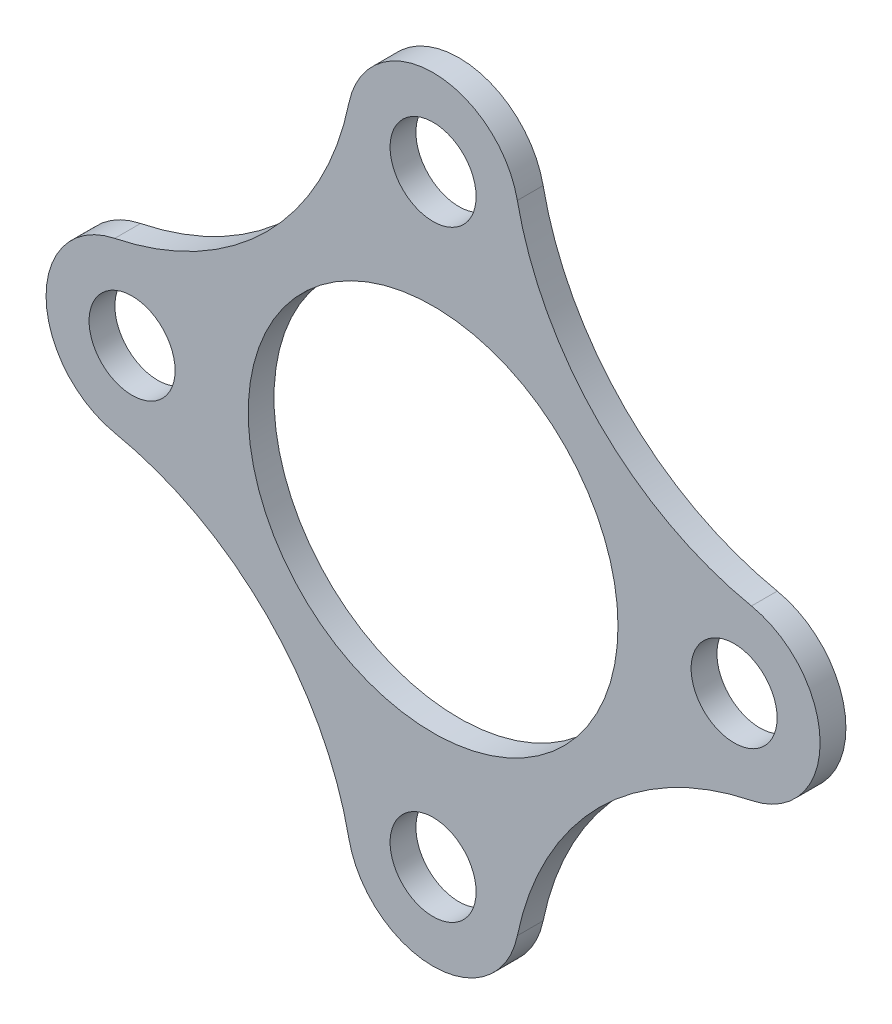
ISO-10303-21;
HEADER;
FILE_DESCRIPTION(('STEP AP214'),'2;1');
FILE_NAME('part.step','',(''),(''),'','','');
FILE_SCHEMA(('AUTOMOTIVE_DESIGN { 1 0 10303 214 1 1 1 1 }'));
ENDSEC;
DATA;
#1=APPLICATION_CONTEXT('core data for automotive mechanical design processes');
#2=APPLICATION_PROTOCOL_DEFINITION('international standard','automotive_design',2000,#1);
#3=PRODUCT_CONTEXT('',#1,'mechanical');
#4=PRODUCT('Part','Part','',(#3));
#5=PRODUCT_RELATED_PRODUCT_CATEGORY('part','',(#4));
#6=PRODUCT_DEFINITION_FORMATION('','',#4);
#7=PRODUCT_DEFINITION_CONTEXT('part definition',#1,'design');
#8=PRODUCT_DEFINITION('design','',#6,#7);
#9=PRODUCT_DEFINITION_SHAPE('','',#8);
#10=(LENGTH_UNIT() NAMED_UNIT(*) SI_UNIT(.MILLI.,.METRE.));
#11=(NAMED_UNIT(*) PLANE_ANGLE_UNIT() SI_UNIT($,.RADIAN.));
#12=(NAMED_UNIT(*) SI_UNIT($,.STERADIAN.) SOLID_ANGLE_UNIT());
#13=UNCERTAINTY_MEASURE_WITH_UNIT(LENGTH_MEASURE(1.E-05),#10,'distance_accuracy_value','');
#14=(GEOMETRIC_REPRESENTATION_CONTEXT(3) GLOBAL_UNCERTAINTY_ASSIGNED_CONTEXT((#13)) GLOBAL_UNIT_ASSIGNED_CONTEXT((#10,
#11,#12)) REPRESENTATION_CONTEXT('',''));
#15=CARTESIAN_POINT('',(0.,0.,0.));
#16=DIRECTION('',(0.,0.,1.));
#17=DIRECTION('',(1.,0.,0.));
#18=AXIS2_PLACEMENT_3D('',#15,#16,#17);
#19=CARTESIAN_POINT('',(0.,-35.,3.));
#20=DIRECTION('',(0.,0.,-1.));
#21=DIRECTION('',(-1.,0.,0.));
#22=AXIS2_PLACEMENT_3D('',#19,#20,#21);
#23=CYLINDRICAL_SURFACE('',#22,10.);
#24=DIRECTION('',(0.,0.,-1.));
#25=VECTOR('',#24,1.);
#26=CARTESIAN_POINT('',(9.79452545151926,-37.0167476737415,47.5909934210712));
#27=LINE('',#26,#25);
#28=CARTESIAN_POINT('',(9.79452545151926,-37.0167476737415,3.));
#29=VERTEX_POINT('',#28);
#30=CARTESIAN_POINT('',(9.79452545151926,-37.0167476737415,0.));
#31=VERTEX_POINT('',#30);
#32=EDGE_CURVE('E102',#29,#31,#27,.T.);
#33=ORIENTED_EDGE('',*,*,#32,.F.);
#34=CARTESIAN_POINT('',(0.,-35.,3.));
#35=DIRECTION('',(0.,0.,1.));
#36=DIRECTION('',(1.,0.,0.));
#37=AXIS2_PLACEMENT_3D('',#34,#35,#36);
#38=CIRCLE('',#37,10.);
#39=CARTESIAN_POINT('',(-9.79452545151924,-37.0167476737415,3.));
#40=VERTEX_POINT('',#39);
#41=EDGE_CURVE('E153',#40,#29,#38,.T.);
#42=ORIENTED_EDGE('',*,*,#41,.F.);
#43=DIRECTION('',(0.,0.,-1.));
#44=VECTOR('',#43,1.);
#45=CARTESIAN_POINT('',(-9.79452545151923,-37.0167476737415,47.5909934210712));
#46=LINE('',#45,#44);
#47=CARTESIAN_POINT('',(-9.79452545151923,-37.0167476737415,0.));
#48=VERTEX_POINT('',#47);
#49=EDGE_CURVE('E126',#40,#48,#46,.T.);
#50=ORIENTED_EDGE('',*,*,#49,.T.);
#51=CARTESIAN_POINT('',(0.,-35.,0.));
#52=DIRECTION('',(0.,0.,1.));
#53=DIRECTION('',(1.,0.,0.));
#54=AXIS2_PLACEMENT_3D('',#51,#52,#53);
#55=CIRCLE('',#54,10.);
#56=EDGE_CURVE('E120',#48,#31,#55,.T.);
#57=ORIENTED_EDGE('',*,*,#56,.T.);
#58=EDGE_LOOP('',(#33,#42,#50,#57));
#59=FACE_BOUND('',#58,.T.);
#60=ADVANCED_FACE('F36',(#59),#23,.T.);
#61=CARTESIAN_POINT('',(35.,0.,3.));
#62=DIRECTION('',(0.,0.,-1.));
#63=DIRECTION('',(-1.,0.,0.));
#64=AXIS2_PLACEMENT_3D('',#61,#62,#63);
#65=CYLINDRICAL_SURFACE('',#64,10.);
#66=DIRECTION('',(0.,0.,-1.));
#67=VECTOR('',#66,1.);
#68=CARTESIAN_POINT('',(37.0167476737415,-9.79452545151924,47.5909934210712));
#69=LINE('',#68,#67);
#70=CARTESIAN_POINT('',(37.0167476737415,-9.79452545151924,3.));
#71=VERTEX_POINT('',#70);
#72=CARTESIAN_POINT('',(37.0167476737415,-9.79452545151924,0.));
#73=VERTEX_POINT('',#72);
#74=EDGE_CURVE('E123',#71,#73,#69,.T.);
#75=ORIENTED_EDGE('',*,*,#74,.T.);
#76=CARTESIAN_POINT('',(35.,0.,0.));
#77=DIRECTION('',(0.,0.,1.));
#78=DIRECTION('',(1.,0.,0.));
#79=AXIS2_PLACEMENT_3D('',#76,#77,#78);
#80=CIRCLE('',#79,10.);
#81=CARTESIAN_POINT('',(37.0167476737415,9.79452545151924,0.));
#82=VERTEX_POINT('',#81);
#83=EDGE_CURVE('E122',#73,#82,#80,.T.);
#84=ORIENTED_EDGE('',*,*,#83,.T.);
#85=DIRECTION('',(0.,0.,-1.));
#86=VECTOR('',#85,1.);
#87=CARTESIAN_POINT('',(37.0167476737415,9.79452545151924,47.5909934210712));
#88=LINE('',#87,#86);
#89=CARTESIAN_POINT('',(37.0167476737415,9.79452545151924,3.));
#90=VERTEX_POINT('',#89);
#91=EDGE_CURVE('E330',#90,#82,#88,.T.);
#92=ORIENTED_EDGE('',*,*,#91,.F.);
#93=CARTESIAN_POINT('',(35.,0.,3.));
#94=DIRECTION('',(0.,0.,1.));
#95=DIRECTION('',(1.,0.,0.));
#96=AXIS2_PLACEMENT_3D('',#93,#94,#95);
#97=CIRCLE('',#96,10.);
#98=EDGE_CURVE('E156',#71,#90,#97,.T.);
#99=ORIENTED_EDGE('',*,*,#98,.F.);
#100=EDGE_LOOP('',(#75,#84,#92,#99));
#101=FACE_BOUND('',#100,.T.);
#102=ADVANCED_FACE('F200',(#101),#65,.T.);
#103=CARTESIAN_POINT('',(-35.,0.,3.));
#104=DIRECTION('',(0.,0.,-1.));
#105=DIRECTION('',(-1.,0.,0.));
#106=AXIS2_PLACEMENT_3D('',#103,#104,#105);
#107=CYLINDRICAL_SURFACE('',#106,10.);
#108=DIRECTION('',(0.,0.,-1.));
#109=VECTOR('',#108,1.);
#110=CARTESIAN_POINT('',(-37.0167476737415,-9.79452545151926,47.5909934210712));
#111=LINE('',#110,#109);
#112=CARTESIAN_POINT('',(-37.0167476737415,-9.79452545151926,3.));
#113=VERTEX_POINT('',#112);
#114=CARTESIAN_POINT('',(-37.0167476737415,-9.79452545151926,0.));
#115=VERTEX_POINT('',#114);
#116=EDGE_CURVE('E322',#113,#115,#111,.T.);
#117=ORIENTED_EDGE('',*,*,#116,.F.);
#118=CARTESIAN_POINT('',(-35.,0.,3.));
#119=DIRECTION('',(0.,0.,1.));
#120=DIRECTION('',(1.,0.,0.));
#121=AXIS2_PLACEMENT_3D('',#118,#119,#120);
#122=CIRCLE('',#121,10.);
#123=CARTESIAN_POINT('',(-37.0167476737415,9.79452545151924,3.));
#124=VERTEX_POINT('',#123);
#125=EDGE_CURVE('E150',#124,#113,#122,.T.);
#126=ORIENTED_EDGE('',*,*,#125,.F.);
#127=DIRECTION('',(0.,0.,-1.));
#128=VECTOR('',#127,1.);
#129=CARTESIAN_POINT('',(-37.0167476737415,9.79452545151925,47.5909934210712));
#130=LINE('',#129,#128);
#131=CARTESIAN_POINT('',(-37.0167476737415,9.79452545151925,0.));
#132=VERTEX_POINT('',#131);
#133=EDGE_CURVE('E339',#124,#132,#130,.T.);
#134=ORIENTED_EDGE('',*,*,#133,.T.);
#135=CARTESIAN_POINT('',(-35.,0.,0.));
#136=DIRECTION('',(0.,0.,1.));
#137=DIRECTION('',(1.,0.,0.));
#138=AXIS2_PLACEMENT_3D('',#135,#136,#137);
#139=CIRCLE('',#138,10.);
#140=EDGE_CURVE('E127',#132,#115,#139,.T.);
#141=ORIENTED_EDGE('',*,*,#140,.T.);
#142=EDGE_LOOP('',(#117,#126,#134,#141));
#143=FACE_BOUND('',#142,.T.);
#144=ADVANCED_FACE('F38',(#143),#107,.T.);
#145=CARTESIAN_POINT('',(0.,35.,3.));
#146=DIRECTION('',(0.,0.,-1.));
#147=DIRECTION('',(-1.,0.,0.));
#148=AXIS2_PLACEMENT_3D('',#145,#146,#147);
#149=CYLINDRICAL_SURFACE('',#148,10.);
#150=DIRECTION('',(0.,0.,-1.));
#151=VECTOR('',#150,1.);
#152=CARTESIAN_POINT('',(-9.79452545151926,37.0167476737415,47.5909934210712));
#153=LINE('',#152,#151);
#154=CARTESIAN_POINT('',(-9.79452545151926,37.0167476737415,3.));
#155=VERTEX_POINT('',#154);
#156=CARTESIAN_POINT('',(-9.79452545151926,37.0167476737415,0.));
#157=VERTEX_POINT('',#156);
#158=EDGE_CURVE('E332',#155,#157,#153,.T.);
#159=ORIENTED_EDGE('',*,*,#158,.F.);
#160=CARTESIAN_POINT('',(0.,35.,3.));
#161=DIRECTION('',(0.,0.,1.));
#162=DIRECTION('',(1.,0.,0.));
#163=AXIS2_PLACEMENT_3D('',#160,#161,#162);
#164=CIRCLE('',#163,10.);
#165=CARTESIAN_POINT('',(9.79452545151925,37.0167476737415,3.));
#166=VERTEX_POINT('',#165);
#167=EDGE_CURVE('E163',#166,#155,#164,.T.);
#168=ORIENTED_EDGE('',*,*,#167,.F.);
#169=DIRECTION('',(0.,0.,-1.));
#170=VECTOR('',#169,1.);
#171=CARTESIAN_POINT('',(9.79452545151925,37.0167476737415,47.5909934210712));
#172=LINE('',#171,#170);
#173=CARTESIAN_POINT('',(9.79452545151925,37.0167476737415,0.));
#174=VERTEX_POINT('',#173);
#175=EDGE_CURVE('E159',#166,#174,#172,.T.);
#176=ORIENTED_EDGE('',*,*,#175,.T.);
#177=CARTESIAN_POINT('',(0.,35.,0.));
#178=DIRECTION('',(0.,0.,1.));
#179=DIRECTION('',(1.,0.,0.));
#180=AXIS2_PLACEMENT_3D('',#177,#178,#179);
#181=CIRCLE('',#180,10.);
#182=EDGE_CURVE('E129',#174,#157,#181,.T.);
#183=ORIENTED_EDGE('',*,*,#182,.T.);
#184=EDGE_LOOP('',(#159,#168,#176,#183));
#185=FACE_BOUND('',#184,.T.);
#186=ADVANCED_FACE('F207',(#185),#149,.T.);
#187=CARTESIAN_POINT('',(0.,0.,3.));
#188=DIRECTION('',(0.,0.,-1.));
#189=DIRECTION('',(-1.,0.,0.));
#190=AXIS2_PLACEMENT_3D('',#187,#188,#189);
#191=CYLINDRICAL_SURFACE('',#190,21.5);
#192=CARTESIAN_POINT('',(0.,0.,3.));
#193=DIRECTION('',(0.,0.,1.));
#194=DIRECTION('',(1.,0.,0.));
#195=AXIS2_PLACEMENT_3D('',#192,#193,#194);
#196=CIRCLE('',#195,21.5);
#197=CARTESIAN_POINT('',(21.5,0.,3.));
#198=VERTEX_POINT('',#197);
#199=EDGE_CURVE('E45',#198,#198,#196,.T.);
#200=ORIENTED_EDGE('',*,*,#199,.T.);
#201=EDGE_LOOP('',(#200));
#202=FACE_BOUND('',#201,.T.);
#203=CARTESIAN_POINT('',(0.,0.,0.));
#204=DIRECTION('',(0.,0.,1.));
#205=DIRECTION('',(1.,0.,0.));
#206=AXIS2_PLACEMENT_3D('',#203,#204,#205);
#207=CIRCLE('',#206,21.5);
#208=CARTESIAN_POINT('',(21.5,0.,0.));
#209=VERTEX_POINT('',#208);
#210=EDGE_CURVE('E145',#209,#209,#207,.T.);
#211=ORIENTED_EDGE('',*,*,#210,.F.);
#212=EDGE_LOOP('',(#211));
#213=FACE_BOUND('',#212,.T.);
#214=ADVANCED_FACE('F177',(#202,#213),#191,.F.);
#215=CARTESIAN_POINT('',(35.,0.,3.));
#216=DIRECTION('',(0.,0.,-1.));
#217=DIRECTION('',(-1.,0.,0.));
#218=AXIS2_PLACEMENT_3D('',#215,#216,#217);
#219=CYLINDRICAL_SURFACE('',#218,5.00000000000012);
#220=CARTESIAN_POINT('',(35.,0.,3.));
#221=DIRECTION('',(0.,0.,1.));
#222=DIRECTION('',(1.,0.,0.));
#223=AXIS2_PLACEMENT_3D('',#220,#221,#222);
#224=CIRCLE('',#223,5.00000000000012);
#225=CARTESIAN_POINT('',(40.0000000000001,0.,3.));
#226=VERTEX_POINT('',#225);
#227=EDGE_CURVE('E171',#226,#226,#224,.T.);
#228=ORIENTED_EDGE('',*,*,#227,.T.);
#229=EDGE_LOOP('',(#228));
#230=FACE_BOUND('',#229,.T.);
#231=CARTESIAN_POINT('',(35.,0.,0.));
#232=DIRECTION('',(0.,0.,1.));
#233=DIRECTION('',(1.,0.,0.));
#234=AXIS2_PLACEMENT_3D('',#231,#232,#233);
#235=CIRCLE('',#234,5.00000000000012);
#236=CARTESIAN_POINT('',(40.0000000000001,0.,0.));
#237=VERTEX_POINT('',#236);
#238=EDGE_CURVE('E143',#237,#237,#235,.T.);
#239=ORIENTED_EDGE('',*,*,#238,.F.);
#240=EDGE_LOOP('',(#239));
#241=FACE_BOUND('',#240,.T.);
#242=ADVANCED_FACE('F213',(#230,#241),#219,.F.);
#243=CARTESIAN_POINT('',(0.,-35.,3.));
#244=DIRECTION('',(0.,0.,-1.));
#245=DIRECTION('',(-1.,0.,0.));
#246=AXIS2_PLACEMENT_3D('',#243,#244,#245);
#247=CYLINDRICAL_SURFACE('',#246,5.00000000000024);
#248=CARTESIAN_POINT('',(0.,-35.,3.));
#249=DIRECTION('',(0.,0.,1.));
#250=DIRECTION('',(1.,0.,0.));
#251=AXIS2_PLACEMENT_3D('',#248,#249,#250);
#252=CIRCLE('',#251,5.00000000000024);
#253=CARTESIAN_POINT('',(5.00000000000025,-35.,3.));
#254=VERTEX_POINT('',#253);
#255=EDGE_CURVE('E168',#254,#254,#252,.T.);
#256=ORIENTED_EDGE('',*,*,#255,.T.);
#257=EDGE_LOOP('',(#256));
#258=FACE_BOUND('',#257,.T.);
#259=CARTESIAN_POINT('',(0.,-35.,0.));
#260=DIRECTION('',(0.,0.,1.));
#261=DIRECTION('',(1.,0.,0.));
#262=AXIS2_PLACEMENT_3D('',#259,#260,#261);
#263=CIRCLE('',#262,5.00000000000024);
#264=CARTESIAN_POINT('',(5.00000000000025,-35.,0.));
#265=VERTEX_POINT('',#264);
#266=EDGE_CURVE('E140',#265,#265,#263,.T.);
#267=ORIENTED_EDGE('',*,*,#266,.F.);
#268=EDGE_LOOP('',(#267));
#269=FACE_BOUND('',#268,.T.);
#270=ADVANCED_FACE('F194',(#258,#269),#247,.F.);
#271=CARTESIAN_POINT('',(-35.,0.,3.));
#272=DIRECTION('',(0.,0.,-1.));
#273=DIRECTION('',(-1.,0.,0.));
#274=AXIS2_PLACEMENT_3D('',#271,#272,#273);
#275=CYLINDRICAL_SURFACE('',#274,5.00000000000036);
#276=CARTESIAN_POINT('',(-35.,0.,3.));
#277=DIRECTION('',(0.,0.,1.));
#278=DIRECTION('',(1.,0.,0.));
#279=AXIS2_PLACEMENT_3D('',#276,#277,#278);
#280=CIRCLE('',#279,5.00000000000036);
#281=CARTESIAN_POINT('',(-29.9999999999997,0.,3.));
#282=VERTEX_POINT('',#281);
#283=EDGE_CURVE('E165',#282,#282,#280,.T.);
#284=ORIENTED_EDGE('',*,*,#283,.T.);
#285=EDGE_LOOP('',(#284));
#286=FACE_BOUND('',#285,.T.);
#287=CARTESIAN_POINT('',(-35.,0.,0.));
#288=DIRECTION('',(0.,0.,1.));
#289=DIRECTION('',(1.,0.,0.));
#290=AXIS2_PLACEMENT_3D('',#287,#288,#289);
#291=CIRCLE('',#290,5.00000000000036);
#292=CARTESIAN_POINT('',(-29.9999999999997,0.,0.));
#293=VERTEX_POINT('',#292);
#294=EDGE_CURVE('E137',#293,#293,#291,.T.);
#295=ORIENTED_EDGE('',*,*,#294,.F.);
#296=EDGE_LOOP('',(#295));
#297=FACE_BOUND('',#296,.T.);
#298=ADVANCED_FACE('F189',(#286,#297),#275,.F.);
#299=CARTESIAN_POINT('',(0.,35.,3.));
#300=DIRECTION('',(0.,0.,-1.));
#301=DIRECTION('',(-1.,0.,0.));
#302=AXIS2_PLACEMENT_3D('',#299,#300,#301);
#303=CYLINDRICAL_SURFACE('',#302,5.);
#304=CARTESIAN_POINT('',(0.,35.,3.));
#305=DIRECTION('',(0.,0.,1.));
#306=DIRECTION('',(1.,0.,0.));
#307=AXIS2_PLACEMENT_3D('',#304,#305,#306);
#308=CIRCLE('',#307,5.);
#309=CARTESIAN_POINT('',(5.,35.,3.));
#310=VERTEX_POINT('',#309);
#311=EDGE_CURVE('E11',#310,#310,#308,.T.);
#312=ORIENTED_EDGE('',*,*,#311,.T.);
#313=EDGE_LOOP('',(#312));
#314=FACE_BOUND('',#313,.T.);
#315=CARTESIAN_POINT('',(0.,35.,0.));
#316=DIRECTION('',(0.,0.,1.));
#317=DIRECTION('',(1.,0.,0.));
#318=AXIS2_PLACEMENT_3D('',#315,#316,#317);
#319=CIRCLE('',#318,5.);
#320=CARTESIAN_POINT('',(5.,35.,0.));
#321=VERTEX_POINT('',#320);
#322=EDGE_CURVE('E40',#321,#321,#319,.T.);
#323=ORIENTED_EDGE('',*,*,#322,.F.);
#324=EDGE_LOOP('',(#323));
#325=FACE_BOUND('',#324,.T.);
#326=ADVANCED_FACE('F183',(#314,#325),#303,.F.);
#327=CARTESIAN_POINT('',(0.,0.,3.));
#328=DIRECTION('',(0.,0.,1.));
#329=DIRECTION('',(1.,0.,0.));
#330=AXIS2_PLACEMENT_3D('',#327,#328,#329);
#331=PLANE('',#330);
#332=CARTESIAN_POINT('',(44.0753645318366,-44.0753645318366,3.));
#333=DIRECTION('',(0.,0.,1.));
#334=DIRECTION('',(1.,0.,0.));
#335=AXIS2_PLACEMENT_3D('',#332,#333,#334);
#336=CIRCLE('',#335,35.);
#337=EDGE_CURVE('E108',#29,#71,#336,.F.);
#338=ORIENTED_EDGE('',*,*,#337,.T.);
#339=ORIENTED_EDGE('',*,*,#98,.T.);
#340=CARTESIAN_POINT('',(44.0753645318366,44.0753645318366,3.));
#341=DIRECTION('',(0.,0.,1.));
#342=DIRECTION('',(1.,0.,0.));
#343=AXIS2_PLACEMENT_3D('',#340,#341,#342);
#344=CIRCLE('',#343,35.);
#345=EDGE_CURVE('E132',#90,#166,#344,.F.);
#346=ORIENTED_EDGE('',*,*,#345,.T.);
#347=ORIENTED_EDGE('',*,*,#167,.T.);
#348=CARTESIAN_POINT('',(-44.0753645318366,44.0753645318366,3.));
#349=DIRECTION('',(0.,0.,1.));
#350=DIRECTION('',(1.,0.,0.));
#351=AXIS2_PLACEMENT_3D('',#348,#349,#350);
#352=CIRCLE('',#351,35.);
#353=EDGE_CURVE('E59',#155,#124,#352,.F.);
#354=ORIENTED_EDGE('',*,*,#353,.T.);
#355=ORIENTED_EDGE('',*,*,#125,.T.);
#356=CARTESIAN_POINT('',(-44.0753645318366,-44.0753645318366,3.));
#357=DIRECTION('',(0.,0.,1.));
#358=DIRECTION('',(1.,0.,0.));
#359=AXIS2_PLACEMENT_3D('',#356,#357,#358);
#360=CIRCLE('',#359,35.);
#361=EDGE_CURVE('E53',#40,#113,#360,.T.);
#362=ORIENTED_EDGE('',*,*,#361,.F.);
#363=ORIENTED_EDGE('',*,*,#41,.T.);
#364=EDGE_LOOP('',(#338,#339,#346,#347,#354,#355,#362,#363));
#365=FACE_BOUND('',#364,.T.);
#366=ORIENTED_EDGE('',*,*,#283,.F.);
#367=EDGE_LOOP('',(#366));
#368=FACE_BOUND('',#367,.T.);
#369=ORIENTED_EDGE('',*,*,#255,.F.);
#370=EDGE_LOOP('',(#369));
#371=FACE_BOUND('',#370,.T.);
#372=ORIENTED_EDGE('',*,*,#227,.F.);
#373=EDGE_LOOP('',(#372));
#374=FACE_BOUND('',#373,.T.);
#375=ORIENTED_EDGE('',*,*,#199,.F.);
#376=EDGE_LOOP('',(#375));
#377=FACE_BOUND('',#376,.T.);
#378=ORIENTED_EDGE('',*,*,#311,.F.);
#379=EDGE_LOOP('',(#378));
#380=FACE_BOUND('',#379,.T.);
#381=ADVANCED_FACE('F180',(#365,#368,#371,#374,#377,#380),#331,.T.);
#382=CARTESIAN_POINT('',(0.,0.,0.));
#383=DIRECTION('',(0.,0.,1.));
#384=DIRECTION('',(1.,0.,0.));
#385=AXIS2_PLACEMENT_3D('',#382,#383,#384);
#386=PLANE('',#385);
#387=ORIENTED_EDGE('',*,*,#83,.F.);
#388=CARTESIAN_POINT('',(44.0753645318366,-44.0753645318366,0.));
#389=DIRECTION('',(0.,0.,-1.));
#390=DIRECTION('',(-1.,0.,0.));
#391=AXIS2_PLACEMENT_3D('',#388,#389,#390);
#392=CIRCLE('',#391,35.);
#393=EDGE_CURVE('E105',#31,#73,#392,.T.);
#394=ORIENTED_EDGE('',*,*,#393,.F.);
#395=ORIENTED_EDGE('',*,*,#56,.F.);
#396=CARTESIAN_POINT('',(-44.0753645318366,-44.0753645318366,0.));
#397=DIRECTION('',(0.,0.,1.));
#398=DIRECTION('',(1.,0.,0.));
#399=AXIS2_PLACEMENT_3D('',#396,#397,#398);
#400=CIRCLE('',#399,35.);
#401=EDGE_CURVE('E112',#48,#115,#400,.T.);
#402=ORIENTED_EDGE('',*,*,#401,.T.);
#403=ORIENTED_EDGE('',*,*,#140,.F.);
#404=CARTESIAN_POINT('',(-44.0753645318366,44.0753645318366,0.));
#405=DIRECTION('',(0.,0.,1.));
#406=DIRECTION('',(1.,0.,0.));
#407=AXIS2_PLACEMENT_3D('',#404,#405,#406);
#408=CIRCLE('',#407,35.);
#409=EDGE_CURVE('E334',#157,#132,#408,.F.);
#410=ORIENTED_EDGE('',*,*,#409,.F.);
#411=ORIENTED_EDGE('',*,*,#182,.F.);
#412=CARTESIAN_POINT('',(44.0753645318366,44.0753645318366,0.));
#413=DIRECTION('',(0.,0.,1.));
#414=DIRECTION('',(1.,0.,0.));
#415=AXIS2_PLACEMENT_3D('',#412,#413,#414);
#416=CIRCLE('',#415,35.);
#417=EDGE_CURVE('E331',#82,#174,#416,.F.);
#418=ORIENTED_EDGE('',*,*,#417,.F.);
#419=EDGE_LOOP('',(#387,#394,#395,#402,#403,#410,#411,#418));
#420=FACE_BOUND('',#419,.T.);
#421=ORIENTED_EDGE('',*,*,#294,.T.);
#422=EDGE_LOOP('',(#421));
#423=FACE_BOUND('',#422,.T.);
#424=ORIENTED_EDGE('',*,*,#266,.T.);
#425=EDGE_LOOP('',(#424));
#426=FACE_BOUND('',#425,.T.);
#427=ORIENTED_EDGE('',*,*,#238,.T.);
#428=EDGE_LOOP('',(#427));
#429=FACE_BOUND('',#428,.T.);
#430=ORIENTED_EDGE('',*,*,#210,.T.);
#431=EDGE_LOOP('',(#430));
#432=FACE_BOUND('',#431,.T.);
#433=ORIENTED_EDGE('',*,*,#322,.T.);
#434=EDGE_LOOP('',(#433));
#435=FACE_BOUND('',#434,.T.);
#436=ADVANCED_FACE('F117',(#420,#423,#426,#429,#432,#435),#386,.F.);
#437=CARTESIAN_POINT('',(44.0753645318366,44.0753645318366,47.5909934210712));
#438=DIRECTION('',(0.,0.,-1.));
#439=DIRECTION('',(-1.,0.,0.));
#440=AXIS2_PLACEMENT_3D('',#437,#438,#439);
#441=CYLINDRICAL_SURFACE('',#440,35.);
#442=ORIENTED_EDGE('',*,*,#345,.F.);
#443=ORIENTED_EDGE('',*,*,#91,.T.);
#444=ORIENTED_EDGE('',*,*,#417,.T.);
#445=ORIENTED_EDGE('',*,*,#175,.F.);
#446=EDGE_LOOP('',(#442,#443,#444,#445));
#447=FACE_BOUND('',#446,.T.);
#448=ADVANCED_FACE('F280',(#447),#441,.F.);
#449=CARTESIAN_POINT('',(-44.0753645318366,44.0753645318366,47.5909934210712));
#450=DIRECTION('',(0.,0.,-1.));
#451=DIRECTION('',(-1.,0.,0.));
#452=AXIS2_PLACEMENT_3D('',#449,#450,#451);
#453=CYLINDRICAL_SURFACE('',#452,35.);
#454=ORIENTED_EDGE('',*,*,#353,.F.);
#455=ORIENTED_EDGE('',*,*,#158,.T.);
#456=ORIENTED_EDGE('',*,*,#409,.T.);
#457=ORIENTED_EDGE('',*,*,#133,.F.);
#458=EDGE_LOOP('',(#454,#455,#456,#457));
#459=FACE_BOUND('',#458,.T.);
#460=ADVANCED_FACE('F289',(#459),#453,.F.);
#461=CARTESIAN_POINT('',(-44.0753645318366,-44.0753645318366,47.5909934210712));
#462=DIRECTION('',(0.,0.,-1.));
#463=DIRECTION('',(-1.,0.,0.));
#464=AXIS2_PLACEMENT_3D('',#461,#462,#463);
#465=CYLINDRICAL_SURFACE('',#464,35.);
#466=ORIENTED_EDGE('',*,*,#49,.F.);
#467=ORIENTED_EDGE('',*,*,#361,.T.);
#468=ORIENTED_EDGE('',*,*,#116,.T.);
#469=ORIENTED_EDGE('',*,*,#401,.F.);
#470=EDGE_LOOP('',(#466,#467,#468,#469));
#471=FACE_BOUND('',#470,.T.);
#472=ADVANCED_FACE('F299',(#471),#465,.F.);
#473=CARTESIAN_POINT('',(44.0753645318366,-44.0753645318366,47.5909934210712));
#474=DIRECTION('',(0.,0.,-1.));
#475=DIRECTION('',(-1.,0.,0.));
#476=AXIS2_PLACEMENT_3D('',#473,#474,#475);
#477=CYLINDRICAL_SURFACE('',#476,35.);
#478=ORIENTED_EDGE('',*,*,#337,.F.);
#479=ORIENTED_EDGE('',*,*,#32,.T.);
#480=ORIENTED_EDGE('',*,*,#393,.T.);
#481=ORIENTED_EDGE('',*,*,#74,.F.);
#482=EDGE_LOOP('',(#478,#479,#480,#481));
#483=FACE_BOUND('',#482,.T.);
#484=ADVANCED_FACE('F104',(#483),#477,.F.);
#485=CLOSED_SHELL('',(#60,#102,#144,#186,#214,#242,#270,#298,#326,#381,#436,#448,#460,#472,#484));
#486=MANIFOLD_SOLID_BREP('B2',#485);
#487=ADVANCED_BREP_SHAPE_REPRESENTATION('',(#18,#486),#14);
#488=SHAPE_DEFINITION_REPRESENTATION(#9,#487);
ENDSEC;
END-ISO-10303-21;
